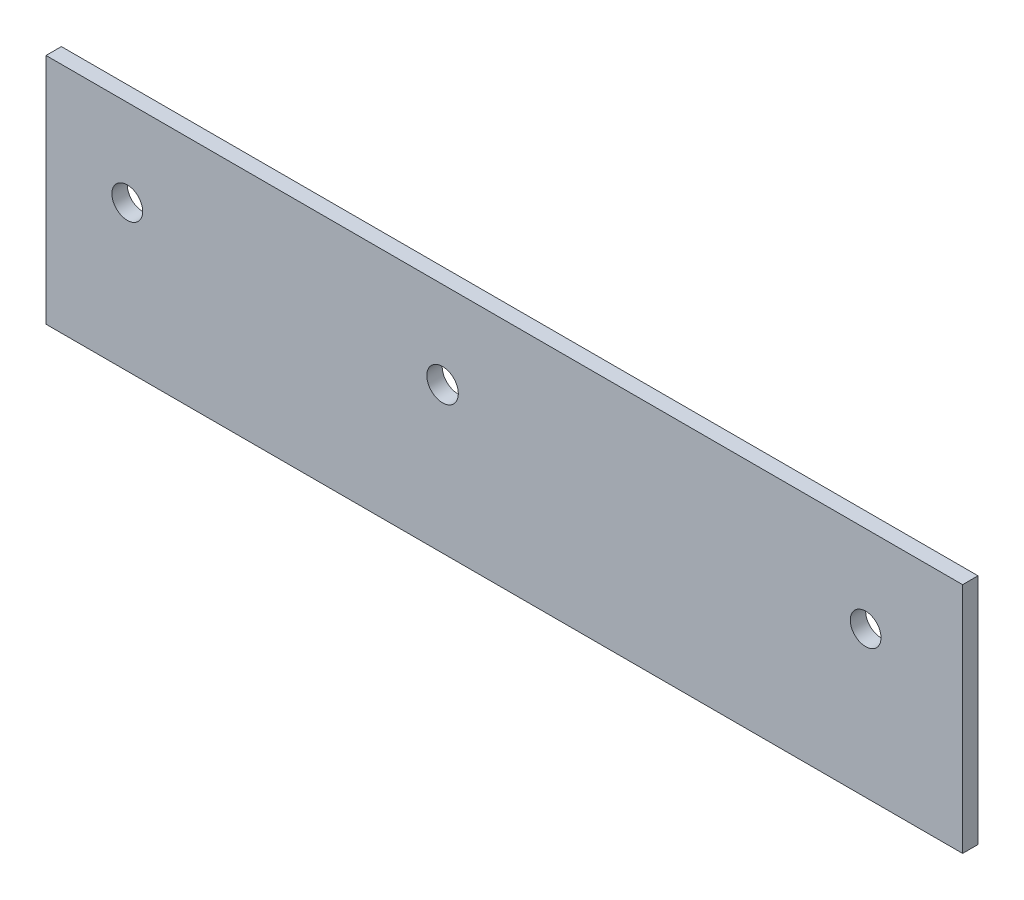
ISO-10303-21;
HEADER;
FILE_DESCRIPTION(('STEP AP214'),'2;1');
FILE_NAME('part.step','',(''),(''),'','','');
FILE_SCHEMA(('AUTOMOTIVE_DESIGN { 1 0 10303 214 1 1 1 1 }'));
ENDSEC;
DATA;
#1=APPLICATION_CONTEXT('core data for automotive mechanical design processes');
#2=APPLICATION_PROTOCOL_DEFINITION('international standard','automotive_design',2000,#1);
#3=PRODUCT_CONTEXT('',#1,'mechanical');
#4=PRODUCT('Part','Part','',(#3));
#5=PRODUCT_RELATED_PRODUCT_CATEGORY('part','',(#4));
#6=PRODUCT_DEFINITION_FORMATION('','',#4);
#7=PRODUCT_DEFINITION_CONTEXT('part definition',#1,'design');
#8=PRODUCT_DEFINITION('design','',#6,#7);
#9=PRODUCT_DEFINITION_SHAPE('','',#8);
#10=(LENGTH_UNIT() NAMED_UNIT(*) SI_UNIT(.MILLI.,.METRE.));
#11=(NAMED_UNIT(*) PLANE_ANGLE_UNIT() SI_UNIT($,.RADIAN.));
#12=(NAMED_UNIT(*) SI_UNIT($,.STERADIAN.) SOLID_ANGLE_UNIT());
#13=UNCERTAINTY_MEASURE_WITH_UNIT(LENGTH_MEASURE(1.E-05),#10,'distance_accuracy_value','');
#14=(GEOMETRIC_REPRESENTATION_CONTEXT(3) GLOBAL_UNCERTAINTY_ASSIGNED_CONTEXT((#13)) GLOBAL_UNIT_ASSIGNED_CONTEXT((#10,
#11,#12)) REPRESENTATION_CONTEXT('',''));
#15=CARTESIAN_POINT('',(0.,0.,0.));
#16=DIRECTION('',(0.,0.,1.));
#17=DIRECTION('',(1.,0.,0.));
#18=AXIS2_PLACEMENT_3D('',#15,#16,#17);
#19=CARTESIAN_POINT('',(0.,0.,3.175));
#20=DIRECTION('',(0.,0.,1.));
#21=DIRECTION('',(1.,0.,0.));
#22=AXIS2_PLACEMENT_3D('',#19,#20,#21);
#23=PLANE('',#22);
#24=CARTESIAN_POINT('',(228.6,-2.22044604925031E-13,3.175));
#25=DIRECTION('',(0.,0.,1.));
#26=DIRECTION('',(1.,0.,0.));
#27=AXIS2_PLACEMENT_3D('',#24,#25,#26);
#28=CIRCLE('',#27,3.175);
#29=CARTESIAN_POINT('',(231.775,-2.22044604925031E-13,3.175));
#30=VERTEX_POINT('',#29);
#31=EDGE_CURVE('E121',#30,#30,#28,.T.);
#32=ORIENTED_EDGE('',*,*,#31,.F.);
#33=EDGE_LOOP('',(#32));
#34=FACE_BOUND('',#33,.T.);
#35=DIRECTION('',(0.,-1.,0.));
#36=VECTOR('',#35,1.);
#37=CARTESIAN_POINT('',(59.4232300435404,17.9178198894467,3.175));
#38=LINE('',#37,#36);
#39=CARTESIAN_POINT('',(59.4232300435404,17.9178198894467,3.175));
#40=VERTEX_POINT('',#39);
#41=CARTESIAN_POINT('',(59.4232300435404,-30.1303964653146,3.175));
#42=VERTEX_POINT('',#41);
#43=EDGE_CURVE('E91',#40,#42,#38,.T.);
#44=ORIENTED_EDGE('',*,*,#43,.T.);
#45=DIRECTION('',(1.,0.,0.));
#46=VECTOR('',#45,1.);
#47=CARTESIAN_POINT('',(59.4232300435404,-30.1303964653146,3.175));
#48=LINE('',#47,#46);
#49=CARTESIAN_POINT('',(248.617209085905,-30.1303964653146,3.175));
#50=VERTEX_POINT('',#49);
#51=EDGE_CURVE('E86',#42,#50,#48,.T.);
#52=ORIENTED_EDGE('',*,*,#51,.T.);
#53=DIRECTION('',(0.,1.,0.));
#54=VECTOR('',#53,1.);
#55=CARTESIAN_POINT('',(248.617209085905,17.9178198894467,3.175));
#56=LINE('',#55,#54);
#57=CARTESIAN_POINT('',(248.617209085905,17.9178198894467,3.175));
#58=VERTEX_POINT('',#57);
#59=EDGE_CURVE('E89',#50,#58,#56,.T.);
#60=ORIENTED_EDGE('',*,*,#59,.T.);
#61=DIRECTION('',(-1.,0.,0.));
#62=VECTOR('',#61,1.);
#63=CARTESIAN_POINT('',(59.4232300435404,17.9178198894467,3.175));
#64=LINE('',#63,#62);
#65=EDGE_CURVE('E56',#58,#40,#64,.T.);
#66=ORIENTED_EDGE('',*,*,#65,.T.);
#67=EDGE_LOOP('',(#44,#52,#60,#66));
#68=FACE_BOUND('',#67,.T.);
#69=CARTESIAN_POINT('',(76.2,5.55111512312578E-13,3.175));
#70=DIRECTION('',(0.,0.,1.));
#71=DIRECTION('',(1.,0.,0.));
#72=AXIS2_PLACEMENT_3D('',#69,#70,#71);
#73=CIRCLE('',#72,3.175);
#74=CARTESIAN_POINT('',(79.375,5.55111512312578E-13,3.175));
#75=VERTEX_POINT('',#74);
#76=EDGE_CURVE('E106',#75,#75,#73,.T.);
#77=ORIENTED_EDGE('',*,*,#76,.F.);
#78=EDGE_LOOP('',(#77));
#79=FACE_BOUND('',#78,.T.);
#80=CARTESIAN_POINT('',(141.2748,0.,3.175));
#81=DIRECTION('',(0.,0.,1.));
#82=DIRECTION('',(1.,0.,0.));
#83=AXIS2_PLACEMENT_3D('',#80,#81,#82);
#84=CIRCLE('',#83,3.25120000000001);
#85=CARTESIAN_POINT('',(144.526,0.,3.175));
#86=VERTEX_POINT('',#85);
#87=EDGE_CURVE('E127',#86,#86,#84,.T.);
#88=ORIENTED_EDGE('',*,*,#87,.F.);
#89=EDGE_LOOP('',(#88));
#90=FACE_BOUND('',#89,.T.);
#91=ADVANCED_FACE('F39',(#34,#68,#79,#90),#23,.T.);
#92=CARTESIAN_POINT('',(0.,0.,0.));
#93=DIRECTION('',(0.,0.,1.));
#94=DIRECTION('',(1.,0.,0.));
#95=AXIS2_PLACEMENT_3D('',#92,#93,#94);
#96=PLANE('',#95);
#97=DIRECTION('',(0.,-1.,0.));
#98=VECTOR('',#97,1.);
#99=CARTESIAN_POINT('',(59.4232300435404,17.9178198894467,0.));
#100=LINE('',#99,#98);
#101=CARTESIAN_POINT('',(59.4232300435404,17.9178198894467,0.));
#102=VERTEX_POINT('',#101);
#103=CARTESIAN_POINT('',(59.4232300435404,-30.1303964653146,0.));
#104=VERTEX_POINT('',#103);
#105=EDGE_CURVE('E103',#102,#104,#100,.T.);
#106=ORIENTED_EDGE('',*,*,#105,.F.);
#107=DIRECTION('',(-1.,0.,0.));
#108=VECTOR('',#107,1.);
#109=CARTESIAN_POINT('',(59.4232300435404,17.9178198894467,0.));
#110=LINE('',#109,#108);
#111=CARTESIAN_POINT('',(248.617209085905,17.9178198894467,0.));
#112=VERTEX_POINT('',#111);
#113=EDGE_CURVE('E79',#112,#102,#110,.T.);
#114=ORIENTED_EDGE('',*,*,#113,.F.);
#115=DIRECTION('',(0.,1.,0.));
#116=VECTOR('',#115,1.);
#117=CARTESIAN_POINT('',(248.617209085905,17.9178198894467,0.));
#118=LINE('',#117,#116);
#119=CARTESIAN_POINT('',(248.617209085905,-30.1303964653146,0.));
#120=VERTEX_POINT('',#119);
#121=EDGE_CURVE('E73',#120,#112,#118,.T.);
#122=ORIENTED_EDGE('',*,*,#121,.F.);
#123=DIRECTION('',(1.,0.,0.));
#124=VECTOR('',#123,1.);
#125=CARTESIAN_POINT('',(59.4232300435404,-30.1303964653146,0.));
#126=LINE('',#125,#124);
#127=EDGE_CURVE('E95',#104,#120,#126,.T.);
#128=ORIENTED_EDGE('',*,*,#127,.F.);
#129=EDGE_LOOP('',(#106,#114,#122,#128));
#130=FACE_BOUND('',#129,.T.);
#131=CARTESIAN_POINT('',(76.2,5.55111512312578E-13,0.));
#132=DIRECTION('',(0.,0.,1.));
#133=DIRECTION('',(1.,0.,0.));
#134=AXIS2_PLACEMENT_3D('',#131,#132,#133);
#135=CIRCLE('',#134,3.175);
#136=CARTESIAN_POINT('',(79.375,5.55111512312578E-13,0.));
#137=VERTEX_POINT('',#136);
#138=EDGE_CURVE('E118',#137,#137,#135,.T.);
#139=ORIENTED_EDGE('',*,*,#138,.T.);
#140=EDGE_LOOP('',(#139));
#141=FACE_BOUND('',#140,.T.);
#142=CARTESIAN_POINT('',(228.6,-2.22044604925031E-13,0.));
#143=DIRECTION('',(0.,0.,1.));
#144=DIRECTION('',(1.,0.,0.));
#145=AXIS2_PLACEMENT_3D('',#142,#143,#144);
#146=CIRCLE('',#145,3.175);
#147=CARTESIAN_POINT('',(231.775,-2.22044604925031E-13,0.));
#148=VERTEX_POINT('',#147);
#149=EDGE_CURVE('E124',#148,#148,#146,.T.);
#150=ORIENTED_EDGE('',*,*,#149,.T.);
#151=EDGE_LOOP('',(#150));
#152=FACE_BOUND('',#151,.T.);
#153=CARTESIAN_POINT('',(141.2748,0.,0.));
#154=DIRECTION('',(0.,0.,1.));
#155=DIRECTION('',(1.,0.,0.));
#156=AXIS2_PLACEMENT_3D('',#153,#154,#155);
#157=CIRCLE('',#156,3.25120000000001);
#158=CARTESIAN_POINT('',(144.526,0.,0.));
#159=VERTEX_POINT('',#158);
#160=EDGE_CURVE('E130',#159,#159,#157,.T.);
#161=ORIENTED_EDGE('',*,*,#160,.T.);
#162=EDGE_LOOP('',(#161));
#163=FACE_BOUND('',#162,.T.);
#164=ADVANCED_FACE('F114',(#130,#141,#152,#163),#96,.F.);
#165=CARTESIAN_POINT('',(59.4232300435404,17.9178198894467,3.175));
#166=DIRECTION('',(1.,0.,0.));
#167=DIRECTION('',(0.,0.,-1.));
#168=AXIS2_PLACEMENT_3D('',#165,#166,#167);
#169=PLANE('',#168);
#170=ORIENTED_EDGE('',*,*,#105,.T.);
#171=DIRECTION('',(0.,0.,-1.));
#172=VECTOR('',#171,1.);
#173=CARTESIAN_POINT('',(59.4232300435404,-30.1303964653146,3.175));
#174=LINE('',#173,#172);
#175=EDGE_CURVE('E11',#42,#104,#174,.T.);
#176=ORIENTED_EDGE('',*,*,#175,.F.);
#177=ORIENTED_EDGE('',*,*,#43,.F.);
#178=DIRECTION('',(0.,0.,-1.));
#179=VECTOR('',#178,1.);
#180=CARTESIAN_POINT('',(59.4232300435404,17.9178198894467,3.175));
#181=LINE('',#180,#179);
#182=EDGE_CURVE('E99',#40,#102,#181,.T.);
#183=ORIENTED_EDGE('',*,*,#182,.T.);
#184=EDGE_LOOP('',(#170,#176,#177,#183));
#185=FACE_BOUND('',#184,.T.);
#186=ADVANCED_FACE('F41',(#185),#169,.F.);
#187=CARTESIAN_POINT('',(59.4232300435404,-30.1303964653146,3.175));
#188=DIRECTION('',(0.,1.,0.));
#189=DIRECTION('',(0.,0.,1.));
#190=AXIS2_PLACEMENT_3D('',#187,#188,#189);
#191=PLANE('',#190);
#192=ORIENTED_EDGE('',*,*,#127,.T.);
#193=DIRECTION('',(0.,0.,-1.));
#194=VECTOR('',#193,1.);
#195=CARTESIAN_POINT('',(248.617209085905,-30.1303964653146,3.175));
#196=LINE('',#195,#194);
#197=EDGE_CURVE('E48',#50,#120,#196,.T.);
#198=ORIENTED_EDGE('',*,*,#197,.F.);
#199=ORIENTED_EDGE('',*,*,#51,.F.);
#200=ORIENTED_EDGE('',*,*,#175,.T.);
#201=EDGE_LOOP('',(#192,#198,#199,#200));
#202=FACE_BOUND('',#201,.T.);
#203=ADVANCED_FACE('F94',(#202),#191,.F.);
#204=CARTESIAN_POINT('',(248.617209085905,17.9178198894467,3.175));
#205=DIRECTION('',(-1.,0.,0.));
#206=DIRECTION('',(0.,0.,1.));
#207=AXIS2_PLACEMENT_3D('',#204,#205,#206);
#208=PLANE('',#207);
#209=ORIENTED_EDGE('',*,*,#121,.T.);
#210=DIRECTION('',(0.,0.,-1.));
#211=VECTOR('',#210,1.);
#212=CARTESIAN_POINT('',(248.617209085905,17.9178198894467,3.175));
#213=LINE('',#212,#211);
#214=EDGE_CURVE('E96',#58,#112,#213,.T.);
#215=ORIENTED_EDGE('',*,*,#214,.F.);
#216=ORIENTED_EDGE('',*,*,#59,.F.);
#217=ORIENTED_EDGE('',*,*,#197,.T.);
#218=EDGE_LOOP('',(#209,#215,#216,#217));
#219=FACE_BOUND('',#218,.T.);
#220=ADVANCED_FACE('F97',(#219),#208,.F.);
#221=CARTESIAN_POINT('',(59.4232300435404,17.9178198894467,3.175));
#222=DIRECTION('',(0.,-1.,0.));
#223=DIRECTION('',(0.,0.,-1.));
#224=AXIS2_PLACEMENT_3D('',#221,#222,#223);
#225=PLANE('',#224);
#226=ORIENTED_EDGE('',*,*,#113,.T.);
#227=ORIENTED_EDGE('',*,*,#182,.F.);
#228=ORIENTED_EDGE('',*,*,#65,.F.);
#229=ORIENTED_EDGE('',*,*,#214,.T.);
#230=EDGE_LOOP('',(#226,#227,#228,#229));
#231=FACE_BOUND('',#230,.T.);
#232=ADVANCED_FACE('F111',(#231),#225,.F.);
#233=CARTESIAN_POINT('',(76.2,5.55111512312578E-13,3.175));
#234=DIRECTION('',(0.,0.,-1.));
#235=DIRECTION('',(-1.,0.,0.));
#236=AXIS2_PLACEMENT_3D('',#233,#234,#235);
#237=CYLINDRICAL_SURFACE('',#236,3.175);
#238=ORIENTED_EDGE('',*,*,#76,.T.);
#239=EDGE_LOOP('',(#238));
#240=FACE_BOUND('',#239,.T.);
#241=ORIENTED_EDGE('',*,*,#138,.F.);
#242=EDGE_LOOP('',(#241));
#243=FACE_BOUND('',#242,.T.);
#244=ADVANCED_FACE('F148',(#240,#243),#237,.F.);
#245=CARTESIAN_POINT('',(228.6,-2.22044604925031E-13,3.175));
#246=DIRECTION('',(0.,0.,-1.));
#247=DIRECTION('',(-1.,0.,0.));
#248=AXIS2_PLACEMENT_3D('',#245,#246,#247);
#249=CYLINDRICAL_SURFACE('',#248,3.175);
#250=ORIENTED_EDGE('',*,*,#31,.T.);
#251=EDGE_LOOP('',(#250));
#252=FACE_BOUND('',#251,.T.);
#253=ORIENTED_EDGE('',*,*,#149,.F.);
#254=EDGE_LOOP('',(#253));
#255=FACE_BOUND('',#254,.T.);
#256=ADVANCED_FACE('F193',(#252,#255),#249,.F.);
#257=CARTESIAN_POINT('',(141.2748,0.,3.175));
#258=DIRECTION('',(0.,0.,-1.));
#259=DIRECTION('',(-1.,0.,0.));
#260=AXIS2_PLACEMENT_3D('',#257,#258,#259);
#261=CYLINDRICAL_SURFACE('',#260,3.25120000000001);
#262=ORIENTED_EDGE('',*,*,#87,.T.);
#263=EDGE_LOOP('',(#262));
#264=FACE_BOUND('',#263,.T.);
#265=ORIENTED_EDGE('',*,*,#160,.F.);
#266=EDGE_LOOP('',(#265));
#267=FACE_BOUND('',#266,.T.);
#268=ADVANCED_FACE('F136',(#264,#267),#261,.F.);
#269=CLOSED_SHELL('',(#91,#164,#186,#203,#220,#232,#244,#256,#268));
#270=MANIFOLD_SOLID_BREP('B2',#269);
#271=ADVANCED_BREP_SHAPE_REPRESENTATION('',(#18,#270),#14);
#272=SHAPE_DEFINITION_REPRESENTATION(#9,#271);
ENDSEC;
END-ISO-10303-21;
